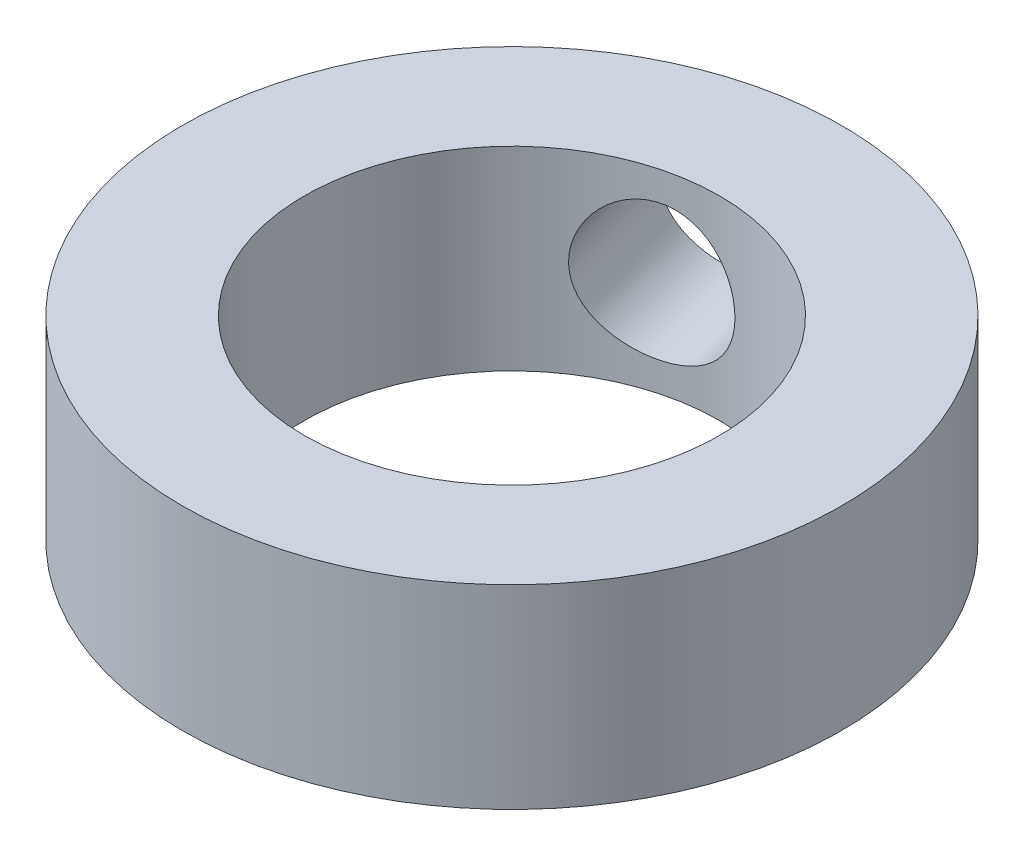
ISO-10303-21;
HEADER;
FILE_DESCRIPTION(('STEP AP214'),'2;1');
FILE_NAME('part.step','',(''),(''),'','','');
FILE_SCHEMA(('AUTOMOTIVE_DESIGN { 1 0 10303 214 1 1 1 1 }'));
ENDSEC;
DATA;
#1=APPLICATION_CONTEXT('core data for automotive mechanical design processes');
#2=APPLICATION_PROTOCOL_DEFINITION('international standard','automotive_design',2000,#1);
#3=PRODUCT_CONTEXT('',#1,'mechanical');
#4=PRODUCT('Part','Part','',(#3));
#5=PRODUCT_RELATED_PRODUCT_CATEGORY('part','',(#4));
#6=PRODUCT_DEFINITION_FORMATION('','',#4);
#7=PRODUCT_DEFINITION_CONTEXT('part definition',#1,'design');
#8=PRODUCT_DEFINITION('design','',#6,#7);
#9=PRODUCT_DEFINITION_SHAPE('','',#8);
#10=(LENGTH_UNIT() NAMED_UNIT(*) SI_UNIT(.MILLI.,.METRE.));
#11=(NAMED_UNIT(*) PLANE_ANGLE_UNIT() SI_UNIT($,.RADIAN.));
#12=(NAMED_UNIT(*) SI_UNIT($,.STERADIAN.) SOLID_ANGLE_UNIT());
#13=UNCERTAINTY_MEASURE_WITH_UNIT(LENGTH_MEASURE(1.E-05),#10,'distance_accuracy_value','');
#14=(GEOMETRIC_REPRESENTATION_CONTEXT(3) GLOBAL_UNCERTAINTY_ASSIGNED_CONTEXT((#13)) GLOBAL_UNIT_ASSIGNED_CONTEXT((#10,
#11,#12)) REPRESENTATION_CONTEXT('',''));
#15=CARTESIAN_POINT('',(0.,0.,0.));
#16=DIRECTION('',(0.,0.,1.));
#17=DIRECTION('',(1.,0.,0.));
#18=AXIS2_PLACEMENT_3D('',#15,#16,#17);
#19=CARTESIAN_POINT('',(0.,15.,0.));
#20=DIRECTION('',(0.,-1.,0.));
#21=DIRECTION('',(0.,0.,-1.));
#22=AXIS2_PLACEMENT_3D('',#19,#20,#21);
#23=CYLINDRICAL_SURFACE('',#22,25.4);
#24=CARTESIAN_POINT('',(-11.3949661213959,7.5,-22.700545083593));
#25=CARTESIAN_POINT('',(-11.3949686574322,7.3542037203055,-22.7005426287149));
#26=CARTESIAN_POINT('',(-11.3894176177606,7.2084451930408,-22.7033324910437));
#27=CARTESIAN_POINT('',(-11.3672560080408,6.91793980072635,-22.7144372196689));
#28=CARTESIAN_POINT('',(-11.3506436402837,6.77319310398597,-22.7227529840455));
#29=CARTESIAN_POINT('',(-11.306457133404,6.48573026429417,-22.7447715199994));
#30=CARTESIAN_POINT('',(-11.2788775489652,6.3430151665637,-22.7584769675627));
#31=CARTESIAN_POINT('',(-11.2129304389085,6.06064333434581,-22.7910408502947));
#32=CARTESIAN_POINT('',(-11.1745589399879,5.92098774674182,-22.8099011832862));
#33=CARTESIAN_POINT('',(-11.0873451358636,5.64596077252988,-22.8524205593688));
#34=CARTESIAN_POINT('',(-11.0385177489886,5.51058359409658,-22.8760727629146));
#35=CARTESIAN_POINT('',(-10.9306494178329,5.24477973608957,-22.9278101947273));
#36=CARTESIAN_POINT('',(-10.8716047050656,5.11435490482544,-22.9558970583072));
#37=CARTESIAN_POINT('',(-10.7437043746201,4.85943648530064,-23.0160336538669));
#38=CARTESIAN_POINT('',(-10.6748530085746,4.73494035772483,-23.0480816677148));
#39=CARTESIAN_POINT('',(-10.5277034509867,4.49259326121771,-23.1156660092184));
#40=CARTESIAN_POINT('',(-10.4494017287135,4.37474480018853,-23.1512036396934));
#41=CARTESIAN_POINT('',(-10.2827353659178,4.14500595445793,-23.2257140332537));
#42=CARTESIAN_POINT('',(-10.194251651498,4.03321462177375,-23.2647259126189));
#43=CARTESIAN_POINT('',(-10.0085634958785,3.81800282425375,-23.3452114411407));
#44=CARTESIAN_POINT('',(-9.91135583404942,3.71458547787581,-23.3866859975187));
#45=CARTESIAN_POINT('',(-9.70884860480749,3.51689422168651,-23.4714784758814));
#46=CARTESIAN_POINT('',(-9.60355141528477,3.42261764326849,-23.5147958545164));
#47=CARTESIAN_POINT('',(-9.3854242358537,3.24378793532573,-23.6027041186518));
#48=CARTESIAN_POINT('',(-9.27259148455468,3.15923840149988,-23.6472954675327));
#49=CARTESIAN_POINT('',(-9.03906091367094,2.9997835069332,-23.7375479700936));
#50=CARTESIAN_POINT('',(-8.91830148441343,2.92497172243659,-23.7832151384452));
#51=CARTESIAN_POINT('',(-8.67056065003231,2.78642121153233,-23.8746481038485));
#52=CARTESIAN_POINT('',(-8.54357693161173,2.72268664266526,-23.9204139314331));
#53=CARTESIAN_POINT('',(-8.28430189383663,2.6068372046235,-24.0114386749655));
#54=CARTESIAN_POINT('',(-8.1520129844386,2.55471712840042,-24.0566978093972));
#55=CARTESIAN_POINT('',(-7.88297292897661,2.46245640374479,-24.1461986472177));
#56=CARTESIAN_POINT('',(-7.74622018451667,2.42232009980148,-24.190439976269));
#57=CARTESIAN_POINT('',(-7.33466771205289,2.32142645201832,-24.3196233167342));
#58=CARTESIAN_POINT('',(-7.0545984778643,2.27841538664732,-24.4024305901958));
#59=CARTESIAN_POINT('',(-6.48891895342731,2.24186526558015,-24.5589126875293));
#60=CARTESIAN_POINT('',(-6.20330923490009,2.24832113220613,-24.6325884479432));
#61=CARTESIAN_POINT('',(-5.63910857041918,2.30993441530352,-24.7677876712837));
#62=CARTESIAN_POINT('',(-5.36047693423994,2.36434984618236,-24.8294788738038));
#63=CARTESIAN_POINT('',(-4.81388408458172,2.51917670288688,-24.9412191108017));
#64=CARTESIAN_POINT('',(-4.54592331865241,2.61959005571928,-24.9912676573972));
#65=CARTESIAN_POINT('',(-4.02659474532817,2.86423436433418,-25.0802006450813));
#66=CARTESIAN_POINT('',(-3.77534938271638,3.00875279704981,-25.1190084838859));
#67=CARTESIAN_POINT('',(-3.29858450593492,3.33729290757149,-25.1860554697708));
#68=CARTESIAN_POINT('',(-3.07306814792324,3.521319423843,-25.2142933212057));
#69=CARTESIAN_POINT('',(-2.65035602926807,3.92771258218978,-25.2622599889264));
#70=CARTESIAN_POINT('',(-2.45376521109053,4.15072882180871,-25.2818207264009));
#71=CARTESIAN_POINT('',(-2.1000912229296,4.62663153743516,-25.3136572496695));
#72=CARTESIAN_POINT('',(-1.94300890549092,4.87951865784642,-25.3259328782677));
#73=CARTESIAN_POINT('',(-1.6731808382118,5.40892543762998,-25.3451947219864));
#74=CARTESIAN_POINT('',(-1.56054288741701,5.68550060030619,-25.3521681141036));
#75=CARTESIAN_POINT('',(-1.38416161698901,6.2538857702709,-25.362412780928));
#76=CARTESIAN_POINT('',(-1.32041144965996,6.54569363780149,-25.3656845741476));
#77=CARTESIAN_POINT('',(-1.2448794901046,7.13055467969738,-25.3695032375983));
#78=CARTESIAN_POINT('',(-1.23217039250848,7.42348790931901,-25.3700987540148));
#79=CARTESIAN_POINT('',(-1.25663836106812,8.00724377600558,-25.3688983881113));
#80=CARTESIAN_POINT('',(-1.2938123925861,8.29806654037847,-25.3671026512631));
#81=CARTESIAN_POINT('',(-1.41602124160598,8.86625202928703,-25.3605703034939));
#82=CARTESIAN_POINT('',(-1.50055644832922,9.14372295279065,-25.355864339485));
#83=CARTESIAN_POINT('',(-1.71419326768912,9.68082787830681,-25.342314960731));
#84=CARTESIAN_POINT('',(-1.84329876227715,9.94046032427375,-25.3334711855698));
#85=CARTESIAN_POINT('',(-2.14397000662465,10.438481550661,-25.3098076355169));
#86=CARTESIAN_POINT('',(-2.31609949545547,10.6765259885616,-25.2949067261043));
#87=CARTESIAN_POINT('',(-2.69653544852218,11.120997015399,-25.2571801836372));
#88=CARTESIAN_POINT('',(-2.90484590217691,11.3274201129459,-25.2343536764055));
#89=CARTESIAN_POINT('',(-3.35518032006567,11.7062648123818,-25.1784629719225));
#90=CARTESIAN_POINT('',(-3.59770339789317,11.8780698702064,-25.1452362251814));
#91=CARTESIAN_POINT('',(-4.10652990913368,12.1784148372513,-25.0671605428036));
#92=CARTESIAN_POINT('',(-4.37283230116776,12.3069566399454,-25.0223121159572));
#93=CARTESIAN_POINT('',(-4.91952685253712,12.516245798997,-24.9205759070931));
#94=CARTESIAN_POINT('',(-5.19982463170899,12.5972759757957,-24.8637621610279));
#95=CARTESIAN_POINT('',(-5.76771841094052,12.7101175687805,-24.7381833621658));
#96=CARTESIAN_POINT('',(-6.05531346425939,12.7419353368822,-24.6694198530164));
#97=CARTESIAN_POINT('',(-6.48260534526029,12.7519554704946,-24.5592586302906));
#98=CARTESIAN_POINT('',(-6.62310762087678,12.7491994670923,-24.5217365484845));
#99=CARTESIAN_POINT('',(-6.90273319627944,12.731645194805,-24.4444929392524));
#100=CARTESIAN_POINT('',(-7.0418569998955,12.7168515033976,-24.4047722532224));
#101=CARTESIAN_POINT('',(-7.31779665240007,12.675326970636,-24.323457213974));
#102=CARTESIAN_POINT('',(-7.45461168994115,12.6485920199507,-24.2818622201866));
#103=CARTESIAN_POINT('',(-7.7249106990165,12.5834102514887,-24.1972270869507));
#104=CARTESIAN_POINT('',(-7.85839584118088,12.5449676141799,-24.1541874682078));
#105=CARTESIAN_POINT('',(-8.12089693126966,12.4567629296061,-24.0671999296165));
#106=CARTESIAN_POINT('',(-8.24992226514935,12.4070265635644,-24.0232542730534));
#107=CARTESIAN_POINT('',(-8.50294795679098,12.2965780743989,-23.9348664087266));
#108=CARTESIAN_POINT('',(-8.62695007233581,12.2358698320134,-23.8904243817262));
#109=CARTESIAN_POINT('',(-8.86926055008253,12.1038777737804,-23.8015310603052));
#110=CARTESIAN_POINT('',(-8.98756652081793,12.032589566448,-23.757079769727));
#111=CARTESIAN_POINT('',(-9.21768035953034,11.8799832637829,-23.6687463804405));
#112=CARTESIAN_POINT('',(-9.32949043158483,11.7986686000429,-23.6248640926403));
#113=CARTESIAN_POINT('',(-9.54790174052592,11.6250348061434,-23.5374521038117));
#114=CARTESIAN_POINT('',(-9.65437752882324,11.5325479538123,-23.493942022797));
#115=CARTESIAN_POINT('',(-9.85930555876516,11.3384118874026,-23.408682342555));
#116=CARTESIAN_POINT('',(-9.95776059525009,11.2367658910651,-23.3669321325668));
#117=CARTESIAN_POINT('',(-10.1461691308755,11.024904528005,-23.2857420627589));
#118=CARTESIAN_POINT('',(-10.2361175083268,10.914684070637,-23.2463036001603));
#119=CARTESIAN_POINT('',(-10.4068857511373,10.6865058304199,-23.1703573787391));
#120=CARTESIAN_POINT('',(-10.4877089524723,10.5685509002262,-23.1338485503241));
#121=CARTESIAN_POINT('',(-10.6407025457246,10.3241869344816,-23.0638811412704));
#122=CARTESIAN_POINT('',(-10.7127568187653,10.1976930925081,-23.0304646605911));
#123=CARTESIAN_POINT('',(-10.8465881368712,9.93846944707455,-22.9677379682637));
#124=CARTESIAN_POINT('',(-10.9083689681205,9.8057419641972,-22.9384262444759));
#125=CARTESIAN_POINT('',(-11.0212577552657,9.53500832549387,-22.8844007281955));
#126=CARTESIAN_POINT('',(-11.0723720045759,9.39700533947855,-22.8596842254106));
#127=CARTESIAN_POINT('',(-11.1636240500915,9.11668161071756,-22.8152594468278));
#128=CARTESIAN_POINT('',(-11.2037639166728,8.97436168802117,-22.795550226429));
#129=CARTESIAN_POINT('',(-11.2902209651342,8.61372777160833,-22.7528972478988));
#130=CARTESIAN_POINT('',(-11.3294546175725,8.39326573619511,-22.7333300932618));
#131=CARTESIAN_POINT('',(-11.3818247361304,7.94850594033497,-22.7071561517606));
#132=CARTESIAN_POINT('',(-11.3949622214303,7.72420833003071,-22.7005488587519));
#133=CARTESIAN_POINT('',(-11.3949661213959,7.5,-22.700545083593));
#134=B_SPLINE_CURVE_WITH_KNOTS('',3,(#24,#25,#26,#27,#28,#29,#30,#31,#32,#33,#34,#35,#36,#37,
#38,#39,#40,#41,#42,#43,#44,#45,#46,#47,#48,#49,#50,#51,#52,#53,#54,#55,#56,#57,#58,#59,#60,#61,
#62,#63,#64,#65,#66,#67,#68,#69,#70,#71,#72,#73,#74,#75,#76,#77,#78,#79,#80,#81,#82,#83,#84,#85,
#86,#87,#88,#89,#90,#91,#92,#93,#94,#95,#96,#97,#98,#99,#100,#101,#102,#103,#104,#105,#106,#107,
#108,#109,#110,#111,#112,#113,#114,#115,#116,#117,#118,#119,#120,#121,#122,#123,#124,#125,#126,
#127,#128,#129,#130,#131,#132,#133),.UNSPECIFIED.,.T.,.F.,(4,2,2,2,2,2,2,2,2,2,2,2,2,2,2,2,2,2,
2,2,2,2,2,2,2,2,2,2,2,2,2,2,2,2,2,2,2,2,2,2,2,2,2,2,2,2,2,2,2,2,2,2,2,2,4),(0.,0.4371916397258,
0.874454350055237,1.31193443665189,1.7495758033862,2.18659686061223,2.62377945052163,
3.06077307547453,3.4979304731905,3.94085215316001,4.38393802498139,4.82689414786428,
5.27001349130047,5.71711813769689,6.16439023233453,6.61146139920692,7.05869444700077,
7.93962195082291,8.82045903047761,9.68790323484875,10.5553837826813,11.4286439072557,
12.302011039088,13.1916265992847,14.0812613546412,14.973040831461,15.8646953741945,
16.7400751502552,17.6154016750434,18.4816637199906,19.348001233059,20.2263470986855,
21.1047898748464,21.997712334715,22.8905957095617,23.7781086318926,24.6655069921027,
25.1014381543361,25.5372036258546,25.9731191724935,26.408879248748,26.8436581847924,
27.2782836399915,27.7130900047779,28.147747966361,28.5900149264529,29.0321271130111,
29.4745038140649,29.9167182640668,30.3642662698568,30.8116489685513,31.2587669549517,
31.7058005318568,32.378148523901,33.0504702570186),.UNSPECIFIED.);
#135=CARTESIAN_POINT('',(-11.3949661213959,7.5,-22.700545083593));
#136=VERTEX_POINT('',#135);
#137=EDGE_CURVE('E10',#136,#136,#134,.T.);
#138=ORIENTED_EDGE('',*,*,#137,.T.);
#139=EDGE_LOOP('',(#138));
#140=FACE_BOUND('',#139,.T.);
#141=CARTESIAN_POINT('',(0.,15.,0.));
#142=DIRECTION('',(0.,1.,0.));
#143=DIRECTION('',(0.,0.,1.));
#144=AXIS2_PLACEMENT_3D('',#141,#142,#143);
#145=CIRCLE('',#144,25.4);
#146=CARTESIAN_POINT('',(0.,15.,25.4));
#147=VERTEX_POINT('',#146);
#148=EDGE_CURVE('E39',#147,#147,#145,.T.);
#149=ORIENTED_EDGE('',*,*,#148,.F.);
#150=EDGE_LOOP('',(#149));
#151=FACE_BOUND('',#150,.T.);
#152=CARTESIAN_POINT('',(0.,0.,0.));
#153=DIRECTION('',(0.,1.,0.));
#154=DIRECTION('',(0.,0.,1.));
#155=AXIS2_PLACEMENT_3D('',#152,#153,#154);
#156=CIRCLE('',#155,25.4);
#157=CARTESIAN_POINT('',(0.,0.,25.4));
#158=VERTEX_POINT('',#157);
#159=EDGE_CURVE('E43',#158,#158,#156,.T.);
#160=ORIENTED_EDGE('',*,*,#159,.T.);
#161=EDGE_LOOP('',(#160));
#162=FACE_BOUND('',#161,.T.);
#163=ADVANCED_FACE('F29',(#140,#151,#162),#23,.T.);
#164=CARTESIAN_POINT('',(0.,15.,0.));
#165=DIRECTION('',(0.,1.,0.));
#166=DIRECTION('',(0.,0.,1.));
#167=AXIS2_PLACEMENT_3D('',#164,#165,#166);
#168=PLANE('',#167);
#169=CARTESIAN_POINT('',(0.,15.,0.));
#170=DIRECTION('',(0.,1.,0.));
#171=DIRECTION('',(0.,0.,1.));
#172=AXIS2_PLACEMENT_3D('',#169,#170,#171);
#173=CIRCLE('',#172,16.);
#174=CARTESIAN_POINT('',(0.,15.,16.));
#175=VERTEX_POINT('',#174);
#176=EDGE_CURVE('E50',#175,#175,#173,.T.);
#177=ORIENTED_EDGE('',*,*,#176,.F.);
#178=EDGE_LOOP('',(#177));
#179=FACE_BOUND('',#178,.T.);
#180=ORIENTED_EDGE('',*,*,#148,.T.);
#181=EDGE_LOOP('',(#180));
#182=FACE_BOUND('',#181,.T.);
#183=ADVANCED_FACE('F75',(#179,#182),#168,.T.);
#184=CARTESIAN_POINT('',(0.,0.,0.));
#185=DIRECTION('',(0.,1.,0.));
#186=DIRECTION('',(0.,0.,1.));
#187=AXIS2_PLACEMENT_3D('',#184,#185,#186);
#188=PLANE('',#187);
#189=CARTESIAN_POINT('',(0.,0.,0.));
#190=DIRECTION('',(0.,1.,0.));
#191=DIRECTION('',(0.,0.,1.));
#192=AXIS2_PLACEMENT_3D('',#189,#190,#191);
#193=CIRCLE('',#192,16.);
#194=CARTESIAN_POINT('',(0.,0.,16.));
#195=VERTEX_POINT('',#194);
#196=EDGE_CURVE('E48',#195,#195,#193,.T.);
#197=ORIENTED_EDGE('',*,*,#196,.T.);
#198=EDGE_LOOP('',(#197));
#199=FACE_BOUND('',#198,.T.);
#200=ORIENTED_EDGE('',*,*,#159,.F.);
#201=EDGE_LOOP('',(#200));
#202=FACE_BOUND('',#201,.T.);
#203=ADVANCED_FACE('F71',(#199,#202),#188,.F.);
#204=CARTESIAN_POINT('',(0.,0.,0.));
#205=DIRECTION('',(0.,1.,0.));
#206=DIRECTION('',(0.,0.,1.));
#207=AXIS2_PLACEMENT_3D('',#204,#205,#206);
#208=CYLINDRICAL_SURFACE('',#207,16.);
#209=CARTESIAN_POINT('',(-8.91966023966802,7.5,-13.2830591811106));
#210=CARTESIAN_POINT('',(-8.91966063926234,7.78623999123775,-13.2830588978193));
#211=CARTESIAN_POINT('',(-8.89903276283584,8.07247900696833,-13.2969805023131));
#212=CARTESIAN_POINT('',(-8.81714845321764,8.63649493183471,-13.3514138789228));
#213=CARTESIAN_POINT('',(-8.75588426572534,8.91427021532119,-13.3919307259797));
#214=CARTESIAN_POINT('',(-8.5945788930918,9.45309978684559,-13.4960113399409));
#215=CARTESIAN_POINT('',(-8.49461179381224,9.71418491765717,-13.5595310593803));
#216=CARTESIAN_POINT('',(-8.25822988223364,10.2138017635542,-13.7047733653584));
#217=CARTESIAN_POINT('',(-8.12180742287889,10.4523287324993,-13.7864997704221));
#218=CARTESIAN_POINT('',(-7.80991996833317,10.9090988821987,-13.9656189601462));
#219=CARTESIAN_POINT('',(-7.63327340936595,11.1263621147882,-14.0634539353141));
#220=CARTESIAN_POINT('',(-7.24720530022966,11.5256483131268,-14.2662363798859));
#221=CARTESIAN_POINT('',(-7.03777867765284,11.7076658151615,-14.3711849486244));
#222=CARTESIAN_POINT('',(-6.58453468778676,12.0357088642128,-14.584515911257));
#223=CARTESIAN_POINT('',(-6.33998383112028,12.1807121346096,-14.692918203698));
#224=CARTESIAN_POINT('',(-5.82635095214381,12.4238550635939,-14.904046134474));
#225=CARTESIAN_POINT('',(-5.55727534527305,12.5220069363935,-15.0067732461528));
#226=CARTESIAN_POINT('',(-5.01127226850493,12.665350860901,-15.1976287720983));
#227=CARTESIAN_POINT('',(-4.73491750491432,12.7122206628969,-15.2861332364966));
#228=CARTESIAN_POINT('',(-4.17413591740936,12.7569998107175,-15.448680365667));
#229=CARTESIAN_POINT('',(-3.88971112882599,12.7549213939875,-15.5227266404343));
#230=CARTESIAN_POINT('',(-3.33243501284133,12.7029373758687,-15.6516333438569));
#231=CARTESIAN_POINT('',(-3.05955480414892,12.6548531678085,-15.7071161828038));
#232=CARTESIAN_POINT('',(-2.52231966191649,12.5152285393295,-15.8022899915352));
#233=CARTESIAN_POINT('',(-2.25796530258159,12.4236851984931,-15.8419798997184));
#234=CARTESIAN_POINT('',(-1.741800047591,12.1986504931013,-15.9070655975076));
#235=CARTESIAN_POINT('',(-1.490195505722,12.0646321050164,-15.9322699517356));
#236=CARTESIAN_POINT('',(-1.00998425127104,11.7588828999032,-15.969910243933));
#237=CARTESIAN_POINT('',(-0.781383816490804,11.5871418288635,-15.9823427049413));
#238=CARTESIAN_POINT('',(-0.343457654033084,11.201599361394,-15.9978829296414));
#239=CARTESIAN_POINT('',(-0.135490535437442,10.9862342741626,-16.0005385048958));
#240=CARTESIAN_POINT('',(0.242333224012556,10.5242779746565,-15.9992831300421));
#241=CARTESIAN_POINT('',(0.412184364165881,10.2776822633624,-15.9953712328403));
#242=CARTESIAN_POINT('',(0.709901094800125,9.75586274999432,-15.9849497583756));
#243=CARTESIAN_POINT('',(0.837171925272614,9.48029882749578,-15.9784059859752));
#244=CARTESIAN_POINT('',(1.04117205123881,8.91105002247919,-15.9664186935092));
#245=CARTESIAN_POINT('',(1.11792174467355,8.61737250578124,-15.9609747300111));
#246=CARTESIAN_POINT('',(1.21506941056315,8.03403626134952,-15.9538675164095));
#247=CARTESIAN_POINT('',(1.23779181004801,7.74476642892499,-15.9520488845533));
#248=CARTESIAN_POINT('',(1.23263991700811,7.16671144498492,-15.9524487149529));
#249=CARTESIAN_POINT('',(1.20477445266815,6.87792621770276,-15.9546664728106));
#250=CARTESIAN_POINT('',(1.10153971498755,6.3189455397546,-15.9621147594001));
#251=CARTESIAN_POINT('',(1.02776478341286,6.04845108055946,-15.9672436839233));
#252=CARTESIAN_POINT('',(0.837202744990423,5.52310292825077,-15.9783647183873));
#253=CARTESIAN_POINT('',(0.720408164016162,5.26825196198013,-15.9843569782116));
#254=CARTESIAN_POINT('',(0.443739593959416,4.77268318887593,-15.9944605927902));
#255=CARTESIAN_POINT('',(0.282643701782038,4.5326473205719,-15.9985079638044));
#256=CARTESIAN_POINT('',(-0.0756453724263151,4.08115439236188,-16.000822523933));
#257=CARTESIAN_POINT('',(-0.272848875642386,3.8697055340331,-15.999088057892));
#258=CARTESIAN_POINT('',(-0.707597086558785,3.47125654235612,-15.9858898938421));
#259=CARTESIAN_POINT('',(-0.946588734952097,3.28584543117598,-15.9739786325804));
#260=CARTESIAN_POINT('',(-1.45085468261462,2.95685753542078,-15.9360866301769));
#261=CARTESIAN_POINT('',(-1.71612796724953,2.81327913668603,-15.9101064320105));
#262=CARTESIAN_POINT('',(-2.26311255168654,2.57336753879086,-15.8415179303172));
#263=CARTESIAN_POINT('',(-2.54469821488449,2.47671611925975,-15.7990252465039));
#264=CARTESIAN_POINT('',(-3.11704514358861,2.33277933742825,-15.6961277497238));
#265=CARTESIAN_POINT('',(-3.40780317441214,2.28547676814028,-15.6357291896283));
#266=CARTESIAN_POINT('',(-3.97573292791549,2.24309118769905,-15.5008020032012));
#267=CARTESIAN_POINT('',(-4.25291912643824,2.24572358701045,-15.4270440103103));
#268=CARTESIAN_POINT('',(-4.79886669862669,2.29752595364831,-15.2660362095198));
#269=CARTESIAN_POINT('',(-5.0676287187456,2.34669234098017,-15.1787874399367));
#270=CARTESIAN_POINT('',(-5.58545061304858,2.48866595340312,-14.9959025374551));
#271=CARTESIAN_POINT('',(-5.83474539957566,2.58080807850382,-14.9004117057324));
#272=CARTESIAN_POINT('',(-6.31226962510594,2.80550602550681,-14.704486977212));
#273=CARTESIAN_POINT('',(-6.54049528671132,2.9380690760517,-14.604052198964));
#274=CARTESIAN_POINT('',(-6.97909937985157,3.2453792565591,-14.3997516446595));
#275=CARTESIAN_POINT('',(-7.18853213382534,3.42148023837901,-14.2958933396723));
#276=CARTESIAN_POINT('',(-7.57590560144923,3.80854309099373,-14.0944461866331));
#277=CARTESIAN_POINT('',(-7.75383638994859,4.01951590832766,-13.9968593206358));
#278=CARTESIAN_POINT('',(-8.08091443374285,4.47982172670808,-13.8107065452109));
#279=CARTESIAN_POINT('',(-8.22872839272958,4.73029853040813,-13.7226175879666));
#280=CARTESIAN_POINT('',(-8.48355648197312,5.25695644457665,-13.5665658788367));
#281=CARTESIAN_POINT('',(-8.59058281906968,5.53312983378814,-13.4985971067831));
#282=CARTESIAN_POINT('',(-8.75635190910351,6.08769349802543,-13.3916219496866));
#283=CARTESIAN_POINT('',(-8.81744378627978,6.36511090751128,-13.3512180700258));
#284=CARTESIAN_POINT('',(-8.89909131800429,6.92835433458492,-13.2969410382062));
#285=CARTESIAN_POINT('',(-8.91965984065674,7.21417765362375,-13.2830594639885));
#286=CARTESIAN_POINT('',(-8.91966023966802,7.5,-13.2830591811106));
#287=B_SPLINE_CURVE_WITH_KNOTS('',3,(#209,#210,#211,#212,#213,#214,#215,#216,#217,#218,#219,
#220,#221,#222,#223,#224,#225,#226,#227,#228,#229,#230,#231,#232,#233,#234,#235,#236,#237,#238,
#239,#240,#241,#242,#243,#244,#245,#246,#247,#248,#249,#250,#251,#252,#253,#254,#255,#256,#257,
#258,#259,#260,#261,#262,#263,#264,#265,#266,#267,#268,#269,#270,#271,#272,#273,#274,#275,#276,
#277,#278,#279,#280,#281,#282,#283,#284,#285,#286),.UNSPECIFIED.,.T.,.F.,(4,2,2,2,2,2,2,2,2,2,2,
2,2,2,2,2,2,2,2,2,2,2,2,2,2,2,2,2,2,2,2,2,2,2,2,2,2,2,4),(0.,0.857662200731016,1.71548810934704,
2.57168000579665,3.42805164244488,4.31388065648357,5.19984688002418,6.10813339010178,
7.01618297936069,7.89354360994141,8.77068489569309,9.61447728120183,10.4583263768849,
11.3130851674632,12.168076591998,13.0621480471497,13.9563484472152,14.8625629319768,
15.7684113072808,16.6345203385931,17.5004782380919,18.3379232251313,19.1755137764532,
20.0390388124152,20.9028110692555,21.8066498220125,22.7104536945702,23.6080400035178,
24.5053132368085,25.3616382800044,26.2178974489868,27.0613236438353,27.9049007606583,
28.7790284198901,29.6534309974958,30.5607004111564,31.467698085371,32.3243809765719,
33.1807917860858),.UNSPECIFIED.);
#288=CARTESIAN_POINT('',(-8.91966023966802,7.5,-13.2830591811106));
#289=VERTEX_POINT('',#288);
#290=EDGE_CURVE('E53',#289,#289,#287,.T.);
#291=ORIENTED_EDGE('',*,*,#290,.T.);
#292=EDGE_LOOP('',(#291));
#293=FACE_BOUND('',#292,.T.);
#294=ORIENTED_EDGE('',*,*,#196,.F.);
#295=EDGE_LOOP('',(#294));
#296=FACE_BOUND('',#295,.T.);
#297=ORIENTED_EDGE('',*,*,#176,.T.);
#298=EDGE_LOOP('',(#297));
#299=FACE_BOUND('',#298,.T.);
#300=ADVANCED_FACE('F60',(#293,#296,#299),#208,.F.);
#301=CARTESIAN_POINT('',(-6.45685990270318,7.5,-24.565605227571));
#302=DIRECTION('',(-0.25420708278359,0.,-0.967149812109095));
#303=DIRECTION('',(-0.967149812109095,0.,0.25420708278359));
#304=AXIS2_PLACEMENT_3D('',#301,#302,#303);
#305=CYLINDRICAL_SURFACE('',#304,5.25);
#306=ORIENTED_EDGE('',*,*,#137,.F.);
#307=EDGE_LOOP('',(#306));
#308=FACE_BOUND('',#307,.T.);
#309=ORIENTED_EDGE('',*,*,#290,.F.);
#310=EDGE_LOOP('',(#309));
#311=FACE_BOUND('',#310,.T.);
#312=ADVANCED_FACE('F63',(#308,#311),#305,.F.);
#313=CLOSED_SHELL('',(#163,#183,#203,#300,#312));
#314=MANIFOLD_SOLID_BREP('B2',#313);
#315=ADVANCED_BREP_SHAPE_REPRESENTATION('',(#18,#314),#14);
#316=SHAPE_DEFINITION_REPRESENTATION(#9,#315);
ENDSEC;
END-ISO-10303-21;
